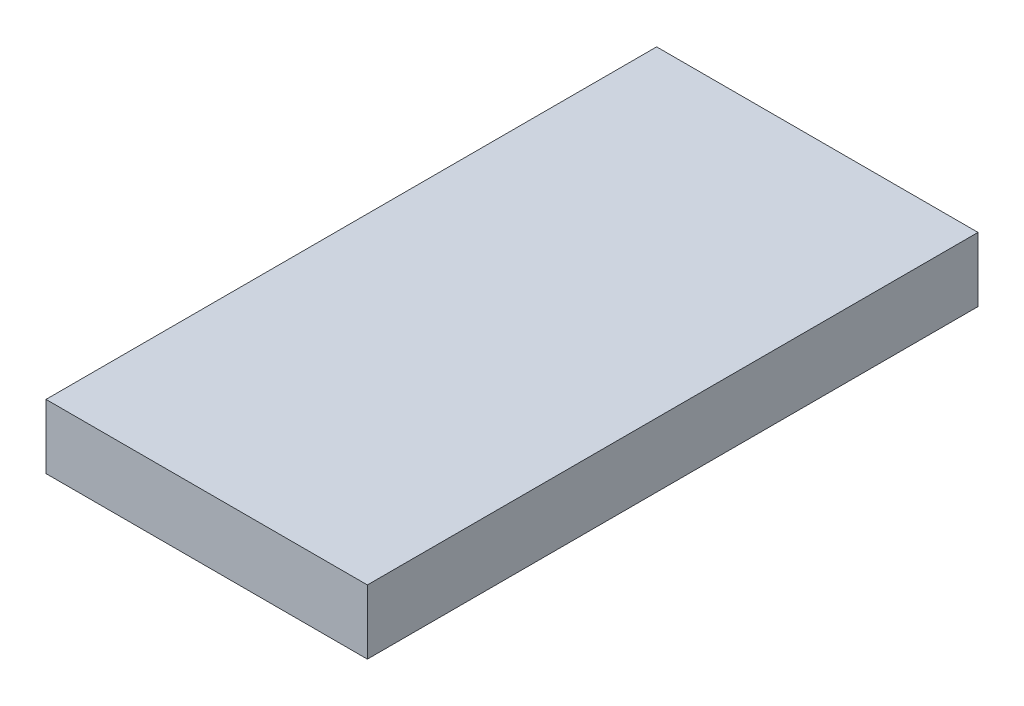
ISO-10303-21;
HEADER;
FILE_DESCRIPTION(('STEP AP214'),'2;1');
FILE_NAME('part.step','',(''),(''),'','','');
FILE_SCHEMA(('AUTOMOTIVE_DESIGN { 1 0 10303 214 1 1 1 1 }'));
ENDSEC;
DATA;
#1=APPLICATION_CONTEXT('core data for automotive mechanical design processes');
#2=APPLICATION_PROTOCOL_DEFINITION('international standard','automotive_design',2000,#1);
#3=PRODUCT_CONTEXT('',#1,'mechanical');
#4=PRODUCT('Part','Part','',(#3));
#5=PRODUCT_RELATED_PRODUCT_CATEGORY('part','',(#4));
#6=PRODUCT_DEFINITION_FORMATION('','',#4);
#7=PRODUCT_DEFINITION_CONTEXT('part definition',#1,'design');
#8=PRODUCT_DEFINITION('design','',#6,#7);
#9=PRODUCT_DEFINITION_SHAPE('','',#8);
#10=(LENGTH_UNIT() NAMED_UNIT(*) SI_UNIT(.MILLI.,.METRE.));
#11=(NAMED_UNIT(*) PLANE_ANGLE_UNIT() SI_UNIT($,.RADIAN.));
#12=(NAMED_UNIT(*) SI_UNIT($,.STERADIAN.) SOLID_ANGLE_UNIT());
#13=UNCERTAINTY_MEASURE_WITH_UNIT(LENGTH_MEASURE(1.E-05),#10,'distance_accuracy_value','');
#14=(GEOMETRIC_REPRESENTATION_CONTEXT(3) GLOBAL_UNCERTAINTY_ASSIGNED_CONTEXT((#13)) GLOBAL_UNIT_ASSIGNED_CONTEXT((#10,
#11,#12)) REPRESENTATION_CONTEXT('',''));
#15=CARTESIAN_POINT('',(0.,0.,0.));
#16=DIRECTION('',(0.,0.,1.));
#17=DIRECTION('',(1.,0.,0.));
#18=AXIS2_PLACEMENT_3D('',#15,#16,#17);
#19=CARTESIAN_POINT('',(-20.2070552147239,20.,-9.66257668711656));
#20=DIRECTION('',(1.,0.,0.));
#21=DIRECTION('',(0.,0.,-1.));
#22=AXIS2_PLACEMENT_3D('',#19,#20,#21);
#23=PLANE('',#22);
#24=DIRECTION('',(0.,0.,1.));
#25=VECTOR('',#24,1.);
#26=CARTESIAN_POINT('',(-20.2070552147239,0.,-9.66257668711656));
#27=LINE('',#26,#25);
#28=CARTESIAN_POINT('',(-20.2070552147239,0.,-9.66257668711656));
#29=VERTEX_POINT('',#28);
#30=CARTESIAN_POINT('',(-20.2070552147239,0.,180.337423312883));
#31=VERTEX_POINT('',#30);
#32=EDGE_CURVE('E102',#29,#31,#27,.T.);
#33=ORIENTED_EDGE('',*,*,#32,.T.);
#34=DIRECTION('',(0.,-1.,0.));
#35=VECTOR('',#34,1.);
#36=CARTESIAN_POINT('',(-20.2070552147239,20.,180.337423312883));
#37=LINE('',#36,#35);
#38=CARTESIAN_POINT('',(-20.2070552147239,20.,180.337423312883));
#39=VERTEX_POINT('',#38);
#40=EDGE_CURVE('E11',#39,#31,#37,.T.);
#41=ORIENTED_EDGE('',*,*,#40,.F.);
#42=DIRECTION('',(0.,0.,1.));
#43=VECTOR('',#42,1.);
#44=CARTESIAN_POINT('',(-20.2070552147239,20.,-9.66257668711656));
#45=LINE('',#44,#43);
#46=CARTESIAN_POINT('',(-20.2070552147239,20.,-9.66257668711656));
#47=VERTEX_POINT('',#46);
#48=EDGE_CURVE('E90',#47,#39,#45,.T.);
#49=ORIENTED_EDGE('',*,*,#48,.F.);
#50=DIRECTION('',(0.,-1.,0.));
#51=VECTOR('',#50,1.);
#52=CARTESIAN_POINT('',(-20.2070552147239,20.,-9.66257668711656));
#53=LINE('',#52,#51);
#54=EDGE_CURVE('E98',#47,#29,#53,.T.);
#55=ORIENTED_EDGE('',*,*,#54,.T.);
#56=EDGE_LOOP('',(#33,#41,#49,#55));
#57=FACE_BOUND('',#56,.T.);
#58=ADVANCED_FACE('F39',(#57),#23,.F.);
#59=CARTESIAN_POINT('',(-20.2070552147239,20.,180.337423312883));
#60=DIRECTION('',(0.,0.,-1.));
#61=DIRECTION('',(-1.,0.,0.));
#62=AXIS2_PLACEMENT_3D('',#59,#60,#61);
#63=PLANE('',#62);
#64=DIRECTION('',(1.,0.,0.));
#65=VECTOR('',#64,1.);
#66=CARTESIAN_POINT('',(-20.2070552147239,0.,180.337423312883));
#67=LINE('',#66,#65);
#68=CARTESIAN_POINT('',(79.792944785276,0.,180.337423312883));
#69=VERTEX_POINT('',#68);
#70=EDGE_CURVE('E94',#31,#69,#67,.T.);
#71=ORIENTED_EDGE('',*,*,#70,.T.);
#72=DIRECTION('',(0.,-1.,0.));
#73=VECTOR('',#72,1.);
#74=CARTESIAN_POINT('',(79.792944785276,20.,180.337423312883));
#75=LINE('',#74,#73);
#76=CARTESIAN_POINT('',(79.792944785276,20.,180.337423312883));
#77=VERTEX_POINT('',#76);
#78=EDGE_CURVE('E47',#77,#69,#75,.T.);
#79=ORIENTED_EDGE('',*,*,#78,.F.);
#80=DIRECTION('',(1.,0.,0.));
#81=VECTOR('',#80,1.);
#82=CARTESIAN_POINT('',(-20.2070552147239,20.,180.337423312883));
#83=LINE('',#82,#81);
#84=EDGE_CURVE('E85',#39,#77,#83,.T.);
#85=ORIENTED_EDGE('',*,*,#84,.F.);
#86=ORIENTED_EDGE('',*,*,#40,.T.);
#87=EDGE_LOOP('',(#71,#79,#85,#86));
#88=FACE_BOUND('',#87,.T.);
#89=ADVANCED_FACE('F93',(#88),#63,.F.);
#90=CARTESIAN_POINT('',(79.792944785276,20.,-9.66257668711656));
#91=DIRECTION('',(-1.,0.,0.));
#92=DIRECTION('',(0.,0.,1.));
#93=AXIS2_PLACEMENT_3D('',#90,#91,#92);
#94=PLANE('',#93);
#95=DIRECTION('',(0.,0.,-1.));
#96=VECTOR('',#95,1.);
#97=CARTESIAN_POINT('',(79.792944785276,0.,-9.66257668711656));
#98=LINE('',#97,#96);
#99=CARTESIAN_POINT('',(79.792944785276,0.,-9.66257668711656));
#100=VERTEX_POINT('',#99);
#101=EDGE_CURVE('E72',#69,#100,#98,.T.);
#102=ORIENTED_EDGE('',*,*,#101,.T.);
#103=DIRECTION('',(0.,-1.,0.));
#104=VECTOR('',#103,1.);
#105=CARTESIAN_POINT('',(79.792944785276,20.,-9.66257668711656));
#106=LINE('',#105,#104);
#107=CARTESIAN_POINT('',(79.792944785276,20.,-9.66257668711656));
#108=VERTEX_POINT('',#107);
#109=EDGE_CURVE('E95',#108,#100,#106,.T.);
#110=ORIENTED_EDGE('',*,*,#109,.F.);
#111=DIRECTION('',(0.,0.,-1.));
#112=VECTOR('',#111,1.);
#113=CARTESIAN_POINT('',(79.792944785276,20.,-9.66257668711656));
#114=LINE('',#113,#112);
#115=EDGE_CURVE('E88',#77,#108,#114,.T.);
#116=ORIENTED_EDGE('',*,*,#115,.F.);
#117=ORIENTED_EDGE('',*,*,#78,.T.);
#118=EDGE_LOOP('',(#102,#110,#116,#117));
#119=FACE_BOUND('',#118,.T.);
#120=ADVANCED_FACE('F96',(#119),#94,.F.);
#121=CARTESIAN_POINT('',(-20.2070552147239,20.,-9.66257668711656));
#122=DIRECTION('',(0.,0.,1.));
#123=DIRECTION('',(1.,0.,0.));
#124=AXIS2_PLACEMENT_3D('',#121,#122,#123);
#125=PLANE('',#124);
#126=DIRECTION('',(-1.,0.,0.));
#127=VECTOR('',#126,1.);
#128=CARTESIAN_POINT('',(-20.2070552147239,0.,-9.66257668711656));
#129=LINE('',#128,#127);
#130=EDGE_CURVE('E78',#100,#29,#129,.T.);
#131=ORIENTED_EDGE('',*,*,#130,.T.);
#132=ORIENTED_EDGE('',*,*,#54,.F.);
#133=DIRECTION('',(-1.,0.,0.));
#134=VECTOR('',#133,1.);
#135=CARTESIAN_POINT('',(-20.2070552147239,20.,-9.66257668711656));
#136=LINE('',#135,#134);
#137=EDGE_CURVE('E55',#108,#47,#136,.T.);
#138=ORIENTED_EDGE('',*,*,#137,.F.);
#139=ORIENTED_EDGE('',*,*,#109,.T.);
#140=EDGE_LOOP('',(#131,#132,#138,#139));
#141=FACE_BOUND('',#140,.T.);
#142=ADVANCED_FACE('F109',(#141),#125,.F.);
#143=CARTESIAN_POINT('',(0.,20.,0.));
#144=DIRECTION('',(0.,1.,0.));
#145=DIRECTION('',(0.,0.,1.));
#146=AXIS2_PLACEMENT_3D('',#143,#144,#145);
#147=PLANE('',#146);
#148=ORIENTED_EDGE('',*,*,#48,.T.);
#149=ORIENTED_EDGE('',*,*,#84,.T.);
#150=ORIENTED_EDGE('',*,*,#115,.T.);
#151=ORIENTED_EDGE('',*,*,#137,.T.);
#152=EDGE_LOOP('',(#148,#149,#150,#151));
#153=FACE_BOUND('',#152,.T.);
#154=ADVANCED_FACE('F86',(#153),#147,.T.);
#155=CARTESIAN_POINT('',(0.,0.,0.));
#156=DIRECTION('',(0.,1.,0.));
#157=DIRECTION('',(0.,0.,1.));
#158=AXIS2_PLACEMENT_3D('',#155,#156,#157);
#159=PLANE('',#158);
#160=ORIENTED_EDGE('',*,*,#32,.F.);
#161=ORIENTED_EDGE('',*,*,#130,.F.);
#162=ORIENTED_EDGE('',*,*,#101,.F.);
#163=ORIENTED_EDGE('',*,*,#70,.F.);
#164=EDGE_LOOP('',(#160,#161,#162,#163));
#165=FACE_BOUND('',#164,.T.);
#166=ADVANCED_FACE('F112',(#165),#159,.F.);
#167=CLOSED_SHELL('',(#58,#89,#120,#142,#154,#166));
#168=MANIFOLD_SOLID_BREP('B2',#167);
#169=ADVANCED_BREP_SHAPE_REPRESENTATION('',(#18,#168),#14);
#170=SHAPE_DEFINITION_REPRESENTATION(#9,#169);
ENDSEC;
END-ISO-10303-21;
